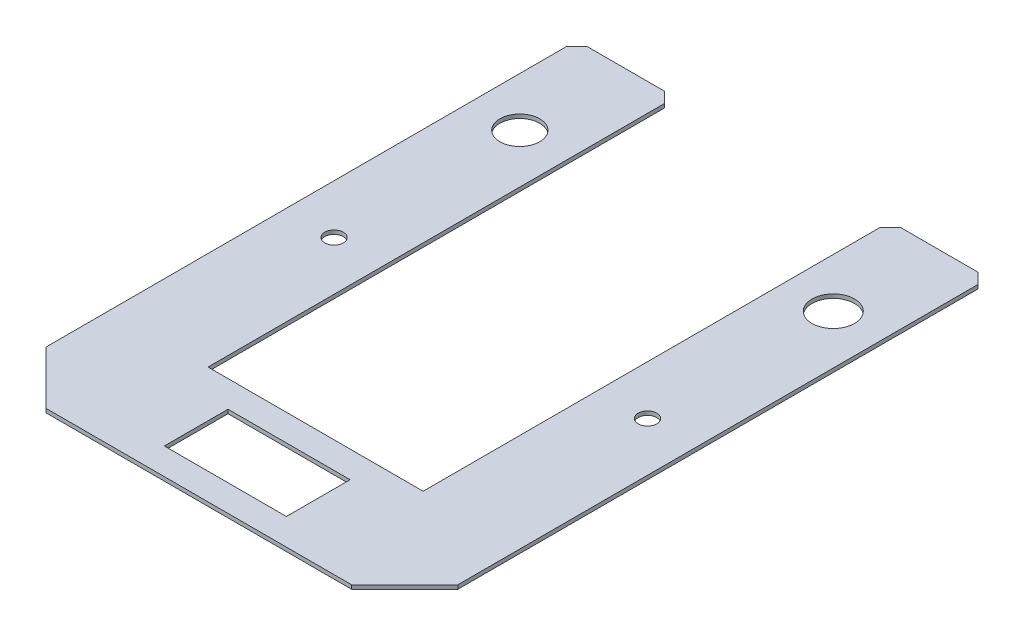
ISO-10303-21;
HEADER;
FILE_DESCRIPTION(('STEP AP214'),'2;1');
FILE_NAME('part.step','',(''),(''),'','','');
FILE_SCHEMA(('AUTOMOTIVE_DESIGN { 1 0 10303 214 1 1 1 1 }'));
ENDSEC;
DATA;
#1=APPLICATION_CONTEXT('core data for automotive mechanical design processes');
#2=APPLICATION_PROTOCOL_DEFINITION('international standard','automotive_design',2000,#1);
#3=PRODUCT_CONTEXT('',#1,'mechanical');
#4=PRODUCT('Part','Part','',(#3));
#5=PRODUCT_RELATED_PRODUCT_CATEGORY('part','',(#4));
#6=PRODUCT_DEFINITION_FORMATION('','',#4);
#7=PRODUCT_DEFINITION_CONTEXT('part definition',#1,'design');
#8=PRODUCT_DEFINITION('design','',#6,#7);
#9=PRODUCT_DEFINITION_SHAPE('','',#8);
#10=(LENGTH_UNIT() NAMED_UNIT(*) SI_UNIT(.MILLI.,.METRE.));
#11=(NAMED_UNIT(*) PLANE_ANGLE_UNIT() SI_UNIT($,.RADIAN.));
#12=(NAMED_UNIT(*) SI_UNIT($,.STERADIAN.) SOLID_ANGLE_UNIT());
#13=UNCERTAINTY_MEASURE_WITH_UNIT(LENGTH_MEASURE(1.E-05),#10,'distance_accuracy_value','');
#14=(GEOMETRIC_REPRESENTATION_CONTEXT(3) GLOBAL_UNCERTAINTY_ASSIGNED_CONTEXT((#13)) GLOBAL_UNIT_ASSIGNED_CONTEXT((#10,
#11,#12)) REPRESENTATION_CONTEXT('',''));
#15=CARTESIAN_POINT('',(0.,0.,0.));
#16=DIRECTION('',(0.,0.,1.));
#17=DIRECTION('',(1.,0.,0.));
#18=AXIS2_PLACEMENT_3D('',#15,#16,#17);
#19=CARTESIAN_POINT('',(-20.,0.7366,-11.));
#20=DIRECTION('',(0.,0.,1.));
#21=DIRECTION('',(1.,0.,0.));
#22=AXIS2_PLACEMENT_3D('',#19,#20,#21);
#23=PLANE('',#22);
#24=DIRECTION('',(-1.,0.,0.));
#25=VECTOR('',#24,1.);
#26=CARTESIAN_POINT('',(-20.,0.,-11.));
#27=LINE('',#26,#25);
#28=CARTESIAN_POINT('',(20.2623728614757,0.,-11.));
#29=VERTEX_POINT('',#28);
#30=CARTESIAN_POINT('',(-20.2623728614757,0.,-11.));
#31=VERTEX_POINT('',#30);
#32=EDGE_CURVE('E233',#29,#31,#27,.T.);
#33=ORIENTED_EDGE('',*,*,#32,.T.);
#34=DIRECTION('',(0.,1.,0.));
#35=VECTOR('',#34,1.);
#36=CARTESIAN_POINT('',(-20.2623728614757,0.,-11.));
#37=LINE('',#36,#35);
#38=CARTESIAN_POINT('',(-20.2623728614757,0.736600000000005,-11.));
#39=VERTEX_POINT('',#38);
#40=EDGE_CURVE('E345',#31,#39,#37,.T.);
#41=ORIENTED_EDGE('',*,*,#40,.T.);
#42=DIRECTION('',(-1.,0.,0.));
#43=VECTOR('',#42,1.);
#44=CARTESIAN_POINT('',(-20.,0.7366,-11.));
#45=LINE('',#44,#43);
#46=CARTESIAN_POINT('',(20.2623728614757,0.736599999999997,-11.));
#47=VERTEX_POINT('',#46);
#48=EDGE_CURVE('E364',#47,#39,#45,.T.);
#49=ORIENTED_EDGE('',*,*,#48,.F.);
#50=DIRECTION('',(0.,1.,0.));
#51=VECTOR('',#50,1.);
#52=CARTESIAN_POINT('',(20.2623728614757,0.,-11.));
#53=LINE('',#52,#51);
#54=EDGE_CURVE('E234',#29,#47,#53,.T.);
#55=ORIENTED_EDGE('',*,*,#54,.F.);
#56=EDGE_LOOP('',(#33,#41,#49,#55));
#57=FACE_BOUND('',#56,.T.);
#58=ADVANCED_FACE('F89',(#57),#23,.F.);
#59=CARTESIAN_POINT('',(-20.,0.7366,11.));
#60=DIRECTION('',(0.,0.,-1.));
#61=DIRECTION('',(-1.,0.,0.));
#62=AXIS2_PLACEMENT_3D('',#59,#60,#61);
#63=PLANE('',#62);
#64=DIRECTION('',(1.,0.,0.));
#65=VECTOR('',#64,1.);
#66=CARTESIAN_POINT('',(-20.,0.7366,11.));
#67=LINE('',#66,#65);
#68=CARTESIAN_POINT('',(-28.7891728614757,0.736600000000056,11.));
#69=VERTEX_POINT('',#68);
#70=CARTESIAN_POINT('',(28.7891728614757,0.736600000000053,11.));
#71=VERTEX_POINT('',#70);
#72=EDGE_CURVE('E366',#69,#71,#67,.T.);
#73=ORIENTED_EDGE('',*,*,#72,.F.);
#74=DIRECTION('',(0.,-1.,0.));
#75=VECTOR('',#74,1.);
#76=CARTESIAN_POINT('',(-28.7891728614757,0.736600000000056,11.));
#77=LINE('',#76,#75);
#78=CARTESIAN_POINT('',(-28.7891728614757,0.,11.));
#79=VERTEX_POINT('',#78);
#80=EDGE_CURVE('E288',#69,#79,#77,.T.);
#81=ORIENTED_EDGE('',*,*,#80,.T.);
#82=DIRECTION('',(1.,0.,0.));
#83=VECTOR('',#82,1.);
#84=CARTESIAN_POINT('',(-20.,0.,11.));
#85=LINE('',#84,#83);
#86=CARTESIAN_POINT('',(28.7891728614757,0.,11.));
#87=VERTEX_POINT('',#86);
#88=EDGE_CURVE('E367',#79,#87,#85,.T.);
#89=ORIENTED_EDGE('',*,*,#88,.T.);
#90=DIRECTION('',(0.,1.,0.));
#91=VECTOR('',#90,1.);
#92=CARTESIAN_POINT('',(28.7891728614757,0.736600000000053,11.));
#93=LINE('',#92,#91);
#94=EDGE_CURVE('E257',#87,#71,#93,.T.);
#95=ORIENTED_EDGE('',*,*,#94,.T.);
#96=EDGE_LOOP('',(#73,#81,#89,#95));
#97=FACE_BOUND('',#96,.T.);
#98=ADVANCED_FACE('F394',(#97),#63,.F.);
#99=CARTESIAN_POINT('',(0.,0.7366,0.));
#100=DIRECTION('',(0.,-1.,0.));
#101=DIRECTION('',(0.,0.,-1.));
#102=AXIS2_PLACEMENT_3D('',#99,#100,#101);
#103=PLANE('',#102);
#104=DIRECTION('',(-1.,0.,0.));
#105=VECTOR('',#104,1.);
#106=CARTESIAN_POINT('',(-11.5,0.7366,-6.));
#107=LINE('',#106,#105);
#108=CARTESIAN_POINT('',(11.5,0.7366,-6.));
#109=VERTEX_POINT('',#108);
#110=CARTESIAN_POINT('',(-11.5,0.7366,-6.));
#111=VERTEX_POINT('',#110);
#112=EDGE_CURVE('E349',#109,#111,#107,.T.);
#113=ORIENTED_EDGE('',*,*,#112,.F.);
#114=DIRECTION('',(0.,0.,-1.));
#115=VECTOR('',#114,1.);
#116=CARTESIAN_POINT('',(11.5,0.7366,6.));
#117=LINE('',#116,#115);
#118=CARTESIAN_POINT('',(11.5,0.7366,6.));
#119=VERTEX_POINT('',#118);
#120=EDGE_CURVE('E104',#119,#109,#117,.T.);
#121=ORIENTED_EDGE('',*,*,#120,.F.);
#122=DIRECTION('',(1.,0.,0.));
#123=VECTOR('',#122,1.);
#124=CARTESIAN_POINT('',(-11.5,0.7366,6.));
#125=LINE('',#124,#123);
#126=CARTESIAN_POINT('',(-11.5,0.7366,6.));
#127=VERTEX_POINT('',#126);
#128=EDGE_CURVE('E354',#127,#119,#125,.T.);
#129=ORIENTED_EDGE('',*,*,#128,.F.);
#130=DIRECTION('',(0.,0.,1.));
#131=VECTOR('',#130,1.);
#132=CARTESIAN_POINT('',(-11.5,0.7366,6.));
#133=LINE('',#132,#131);
#134=EDGE_CURVE('E351',#111,#127,#133,.T.);
#135=ORIENTED_EDGE('',*,*,#134,.F.);
#136=EDGE_LOOP('',(#113,#121,#129,#135));
#137=FACE_BOUND('',#136,.T.);
#138=ORIENTED_EDGE('',*,*,#48,.T.);
#139=DIRECTION('',(0.,0.,-1.));
#140=VECTOR('',#139,1.);
#141=CARTESIAN_POINT('',(-20.2623728614757,0.7366,11.));
#142=LINE('',#141,#140);
#143=CARTESIAN_POINT('',(-20.2623728614757,0.736600000000025,-97.));
#144=VERTEX_POINT('',#143);
#145=EDGE_CURVE('E302',#144,#39,#142,.F.);
#146=ORIENTED_EDGE('',*,*,#145,.F.);
#147=DIRECTION('',(0.70710678118655,0.,0.707106781186545));
#148=VECTOR('',#147,1.);
#149=CARTESIAN_POINT('',(-20.2623728614757,0.736600000000025,-97.));
#150=LINE('',#149,#148);
#151=CARTESIAN_POINT('',(-22.2623728614757,0.736600000000039,-99.));
#152=VERTEX_POINT('',#151);
#153=EDGE_CURVE('E314',#144,#152,#150,.F.);
#154=ORIENTED_EDGE('',*,*,#153,.T.);
#155=DIRECTION('',(-1.,0.,0.));
#156=VECTOR('',#155,1.);
#157=CARTESIAN_POINT('',(-38.7891728614757,0.73660000000015,-99.));
#158=LINE('',#157,#156);
#159=CARTESIAN_POINT('',(-36.7891728614757,0.736600000000136,-99.));
#160=VERTEX_POINT('',#159);
#161=EDGE_CURVE('E340',#160,#152,#158,.F.);
#162=ORIENTED_EDGE('',*,*,#161,.F.);
#163=DIRECTION('',(0.70710678118655,0.,-0.707106781186545));
#164=VECTOR('',#163,1.);
#165=CARTESIAN_POINT('',(-38.7891728614757,0.73660000000015,-97.));
#166=LINE('',#165,#164);
#167=CARTESIAN_POINT('',(-38.7891728614757,0.73660000000015,-97.));
#168=VERTEX_POINT('',#167);
#169=EDGE_CURVE('E311',#160,#168,#166,.F.);
#170=ORIENTED_EDGE('',*,*,#169,.T.);
#171=DIRECTION('',(0.,0.,1.));
#172=VECTOR('',#171,1.);
#173=CARTESIAN_POINT('',(-38.7891728614757,0.736600000000125,11.));
#174=LINE('',#173,#172);
#175=CARTESIAN_POINT('',(-38.7891728614757,0.736600000000129,0.99999999999998));
#176=VERTEX_POINT('',#175);
#177=EDGE_CURVE('E334',#176,#168,#174,.F.);
#178=ORIENTED_EDGE('',*,*,#177,.F.);
#179=DIRECTION('',(-0.707106781186546,0.,-0.707106781186549));
#180=VECTOR('',#179,1.);
#181=CARTESIAN_POINT('',(-28.7891728614757,0.736600000000056,11.));
#182=LINE('',#181,#180);
#183=EDGE_CURVE('E316',#176,#69,#182,.F.);
#184=ORIENTED_EDGE('',*,*,#183,.T.);
#185=ORIENTED_EDGE('',*,*,#72,.T.);
#186=DIRECTION('',(-0.707106781186549,0.,0.707106781186546));
#187=VECTOR('',#186,1.);
#188=CARTESIAN_POINT('',(29.6574728614756,0.736600000000059,10.1317));
#189=LINE('',#188,#187);
#190=CARTESIAN_POINT('',(38.7891728614757,0.736600000000122,1.00000000000002));
#191=VERTEX_POINT('',#190);
#192=EDGE_CURVE('E265',#71,#191,#189,.F.);
#193=ORIENTED_EDGE('',*,*,#192,.T.);
#194=DIRECTION('',(0.,0.,1.));
#195=VECTOR('',#194,1.);
#196=CARTESIAN_POINT('',(38.7891728614757,0.736600000000122,11.));
#197=LINE('',#196,#195);
#198=CARTESIAN_POINT('',(38.7891728614757,0.736600000000108,-97.));
#199=VERTEX_POINT('',#198);
#200=EDGE_CURVE('E278',#199,#191,#197,.T.);
#201=ORIENTED_EDGE('',*,*,#200,.F.);
#202=DIRECTION('',(0.707106781186545,0.,0.70710678118655));
#203=VECTOR('',#202,1.);
#204=CARTESIAN_POINT('',(77.6574728614757,0.736600000000386,-58.1316999999997));
#205=LINE('',#204,#203);
#206=CARTESIAN_POINT('',(36.7891728614757,0.736600000000094,-99.));
#207=VERTEX_POINT('',#206);
#208=EDGE_CURVE('E263',#199,#207,#205,.F.);
#209=ORIENTED_EDGE('',*,*,#208,.T.);
#210=DIRECTION('',(1.,0.,0.));
#211=VECTOR('',#210,1.);
#212=CARTESIAN_POINT('',(38.7891728614757,0.736600000000108,-99.));
#213=LINE('',#212,#211);
#214=CARTESIAN_POINT('',(22.2623728614757,0.736599999999997,-99.));
#215=VERTEX_POINT('',#214);
#216=EDGE_CURVE('E285',#215,#207,#213,.T.);
#217=ORIENTED_EDGE('',*,*,#216,.F.);
#218=DIRECTION('',(0.707106781186545,0.,-0.70710678118655));
#219=VECTOR('',#218,1.);
#220=CARTESIAN_POINT('',(-28.6059271385243,0.736599999999654,-48.1316999999996));
#221=LINE('',#220,#219);
#222=CARTESIAN_POINT('',(20.2623728614757,0.736599999999983,-97.));
#223=VERTEX_POINT('',#222);
#224=EDGE_CURVE('E261',#215,#223,#221,.F.);
#225=ORIENTED_EDGE('',*,*,#224,.T.);
#226=DIRECTION('',(0.,0.,1.));
#227=VECTOR('',#226,1.);
#228=CARTESIAN_POINT('',(20.2623728614757,0.736599999999997,0.));
#229=LINE('',#228,#227);
#230=EDGE_CURVE('E222',#223,#47,#229,.T.);
#231=ORIENTED_EDGE('',*,*,#230,.T.);
#232=EDGE_LOOP('',(#138,#146,#154,#162,#170,#178,#184,#185,#193,#201,#209,#217,#225,#231));
#233=FACE_BOUND('',#232,.T.);
#234=CARTESIAN_POINT('',(-29.5257728614757,0.736600000000084,-79.));
#235=DIRECTION('',(0.,1.,0.));
#236=DIRECTION('',(-1.,0.,0.));
#237=AXIS2_PLACEMENT_3D('',#234,#235,#236);
#238=CIRCLE('',#237,3.75000000000001);
#239=CARTESIAN_POINT('',(-33.2757728614757,0.73660000000011,-79.));
#240=VERTEX_POINT('',#239);
#241=EDGE_CURVE('E319',#240,#240,#238,.T.);
#242=ORIENTED_EDGE('',*,*,#241,.F.);
#243=EDGE_LOOP('',(#242));
#244=FACE_BOUND('',#243,.T.);
#245=CARTESIAN_POINT('',(-29.5257728614757,0.736600000000077,-44.));
#246=DIRECTION('',(0.,1.,0.));
#247=DIRECTION('',(-1.,0.,0.));
#248=AXIS2_PLACEMENT_3D('',#245,#246,#247);
#249=CIRCLE('',#248,1.75);
#250=CARTESIAN_POINT('',(-31.2757728614757,0.736600000000089,-44.));
#251=VERTEX_POINT('',#250);
#252=EDGE_CURVE('E325',#251,#251,#249,.T.);
#253=ORIENTED_EDGE('',*,*,#252,.F.);
#254=EDGE_LOOP('',(#253));
#255=FACE_BOUND('',#254,.T.);
#256=CARTESIAN_POINT('',(29.5257728614757,0.736600000000053,-44.));
#257=DIRECTION('',(0.,1.,0.));
#258=DIRECTION('',(-1.,0.,0.));
#259=AXIS2_PLACEMENT_3D('',#256,#257,#258);
#260=CIRCLE('',#259,1.75);
#261=CARTESIAN_POINT('',(27.7757728614757,0.73660000000004,-44.));
#262=VERTEX_POINT('',#261);
#263=EDGE_CURVE('E267',#262,#262,#260,.T.);
#264=ORIENTED_EDGE('',*,*,#263,.F.);
#265=EDGE_LOOP('',(#264));
#266=FACE_BOUND('',#265,.T.);
#267=CARTESIAN_POINT('',(29.5257728614757,0.736600000000049,-79.));
#268=DIRECTION('',(0.,1.,0.));
#269=DIRECTION('',(-1.,0.,0.));
#270=AXIS2_PLACEMENT_3D('',#267,#268,#269);
#271=CIRCLE('',#270,4.00000000000001);
#272=CARTESIAN_POINT('',(25.5257728614757,0.736600000000021,-79.));
#273=VERTEX_POINT('',#272);
#274=EDGE_CURVE('E270',#273,#273,#271,.T.);
#275=ORIENTED_EDGE('',*,*,#274,.F.);
#276=EDGE_LOOP('',(#275));
#277=FACE_BOUND('',#276,.T.);
#278=ADVANCED_FACE('F391',(#137,#233,#244,#255,#266,#277),#103,.F.);
#279=CARTESIAN_POINT('',(0.,0.,0.));
#280=DIRECTION('',(0.,-1.,0.));
#281=DIRECTION('',(0.,0.,-1.));
#282=AXIS2_PLACEMENT_3D('',#279,#280,#281);
#283=PLANE('',#282);
#284=DIRECTION('',(0.,0.,1.));
#285=VECTOR('',#284,1.);
#286=CARTESIAN_POINT('',(11.5,0.,0.));
#287=LINE('',#286,#285);
#288=CARTESIAN_POINT('',(11.5,0.,-6.));
#289=VERTEX_POINT('',#288);
#290=CARTESIAN_POINT('',(11.5,0.,6.));
#291=VERTEX_POINT('',#290);
#292=EDGE_CURVE('E13',#289,#291,#287,.T.);
#293=ORIENTED_EDGE('',*,*,#292,.F.);
#294=DIRECTION('',(1.,0.,0.));
#295=VECTOR('',#294,1.);
#296=CARTESIAN_POINT('',(0.,0.,-6.));
#297=LINE('',#296,#295);
#298=CARTESIAN_POINT('',(-11.5,0.,-6.));
#299=VERTEX_POINT('',#298);
#300=EDGE_CURVE('E369',#299,#289,#297,.T.);
#301=ORIENTED_EDGE('',*,*,#300,.F.);
#302=DIRECTION('',(0.,0.,-1.));
#303=VECTOR('',#302,1.);
#304=CARTESIAN_POINT('',(-11.5,0.,0.));
#305=LINE('',#304,#303);
#306=CARTESIAN_POINT('',(-11.5,0.,6.));
#307=VERTEX_POINT('',#306);
#308=EDGE_CURVE('E373',#307,#299,#305,.T.);
#309=ORIENTED_EDGE('',*,*,#308,.F.);
#310=DIRECTION('',(-1.,0.,0.));
#311=VECTOR('',#310,1.);
#312=CARTESIAN_POINT('',(0.,0.,6.));
#313=LINE('',#312,#311);
#314=EDGE_CURVE('E97',#291,#307,#313,.T.);
#315=ORIENTED_EDGE('',*,*,#314,.F.);
#316=EDGE_LOOP('',(#293,#301,#309,#315));
#317=FACE_BOUND('',#316,.T.);
#318=ORIENTED_EDGE('',*,*,#88,.F.);
#319=DIRECTION('',(0.707106781186546,0.,0.707106781186549));
#320=VECTOR('',#319,1.);
#321=CARTESIAN_POINT('',(-29.6574728614757,0.,10.1317));
#322=LINE('',#321,#320);
#323=CARTESIAN_POINT('',(-38.7891728614757,1.28369537222284E-13,0.99999999999998));
#324=VERTEX_POINT('',#323);
#325=EDGE_CURVE('E300',#79,#324,#322,.F.);
#326=ORIENTED_EDGE('',*,*,#325,.T.);
#327=DIRECTION('',(0.,0.,-1.));
#328=VECTOR('',#327,1.);
#329=CARTESIAN_POINT('',(-38.7891728614757,1.28369537222284E-13,0.));
#330=LINE('',#329,#328);
#331=CARTESIAN_POINT('',(-38.7891728614757,1.49186218934005E-13,-97.));
#332=VERTEX_POINT('',#331);
#333=EDGE_CURVE('E298',#324,#332,#330,.T.);
#334=ORIENTED_EDGE('',*,*,#333,.T.);
#335=DIRECTION('',(-0.70710678118655,0.,0.707106781186545));
#336=VECTOR('',#335,1.);
#337=CARTESIAN_POINT('',(-77.6574728614756,4.1286418728248E-13,-58.1317000000004));
#338=LINE('',#337,#336);
#339=CARTESIAN_POINT('',(-36.7891728614757,1.35308431126191E-13,-99.));
#340=VERTEX_POINT('',#339);
#341=EDGE_CURVE('E296',#332,#340,#338,.F.);
#342=ORIENTED_EDGE('',*,*,#341,.T.);
#343=DIRECTION('',(1.,0.,0.));
#344=VECTOR('',#343,1.);
#345=CARTESIAN_POINT('',(-19.5257728614757,0.,-99.));
#346=LINE('',#345,#344);
#347=CARTESIAN_POINT('',(-22.2623728614757,0.,-99.));
#348=VERTEX_POINT('',#347);
#349=EDGE_CURVE('E293',#340,#348,#346,.T.);
#350=ORIENTED_EDGE('',*,*,#349,.T.);
#351=DIRECTION('',(-0.70710678118655,0.,-0.707106781186545));
#352=VECTOR('',#351,1.);
#353=CARTESIAN_POINT('',(28.6059271385243,-3.22658566531686E-13,-48.1317000000003));
#354=LINE('',#353,#352);
#355=CARTESIAN_POINT('',(-20.2623728614757,0.,-97.));
#356=VERTEX_POINT('',#355);
#357=EDGE_CURVE('E291',#348,#356,#354,.F.);
#358=ORIENTED_EDGE('',*,*,#357,.T.);
#359=DIRECTION('',(0.,0.,-1.));
#360=VECTOR('',#359,1.);
#361=CARTESIAN_POINT('',(-20.2623728614757,0.,11.));
#362=LINE('',#361,#360);
#363=EDGE_CURVE('E308',#31,#356,#362,.T.);
#364=ORIENTED_EDGE('',*,*,#363,.F.);
#365=ORIENTED_EDGE('',*,*,#32,.F.);
#366=DIRECTION('',(0.,0.,-1.));
#367=VECTOR('',#366,1.);
#368=CARTESIAN_POINT('',(20.2623728614757,0.,-99.));
#369=LINE('',#368,#367);
#370=CARTESIAN_POINT('',(20.2623728614757,0.,-97.));
#371=VERTEX_POINT('',#370);
#372=EDGE_CURVE('E219',#371,#29,#369,.F.);
#373=ORIENTED_EDGE('',*,*,#372,.F.);
#374=DIRECTION('',(-0.707106781186545,0.,0.70710678118655));
#375=VECTOR('',#374,1.);
#376=CARTESIAN_POINT('',(22.2623728614757,0.,-99.));
#377=LINE('',#376,#375);
#378=CARTESIAN_POINT('',(22.2623728614757,0.,-99.));
#379=VERTEX_POINT('',#378);
#380=EDGE_CURVE('E230',#371,#379,#377,.F.);
#381=ORIENTED_EDGE('',*,*,#380,.T.);
#382=DIRECTION('',(-1.,0.,0.));
#383=VECTOR('',#382,1.);
#384=CARTESIAN_POINT('',(19.5257728614756,0.,-99.));
#385=LINE('',#384,#383);
#386=CARTESIAN_POINT('',(36.7891728614757,0.,-99.));
#387=VERTEX_POINT('',#386);
#388=EDGE_CURVE('E240',#379,#387,#385,.F.);
#389=ORIENTED_EDGE('',*,*,#388,.T.);
#390=DIRECTION('',(-0.707106781186545,0.,-0.70710678118655));
#391=VECTOR('',#390,1.);
#392=CARTESIAN_POINT('',(36.7891728614757,0.,-99.));
#393=LINE('',#392,#391);
#394=CARTESIAN_POINT('',(38.7891728614757,1.07552855510562E-13,-97.));
#395=VERTEX_POINT('',#394);
#396=EDGE_CURVE('E225',#387,#395,#393,.F.);
#397=ORIENTED_EDGE('',*,*,#396,.T.);
#398=DIRECTION('',(0.,0.,-1.));
#399=VECTOR('',#398,1.);
#400=CARTESIAN_POINT('',(38.7891728614757,1.21430643318376E-13,0.));
#401=LINE('',#400,#399);
#402=CARTESIAN_POINT('',(38.7891728614757,1.21430643318376E-13,1.00000000000002));
#403=VERTEX_POINT('',#402);
#404=EDGE_CURVE('E245',#395,#403,#401,.F.);
#405=ORIENTED_EDGE('',*,*,#404,.T.);
#406=DIRECTION('',(0.707106781186549,0.,-0.707106781186546));
#407=VECTOR('',#406,1.);
#408=CARTESIAN_POINT('',(38.7891728614757,1.21430643318376E-13,1.00000000000002));
#409=LINE('',#408,#407);
#410=EDGE_CURVE('E241',#403,#87,#409,.F.);
#411=ORIENTED_EDGE('',*,*,#410,.T.);
#412=EDGE_LOOP('',(#318,#326,#334,#342,#350,#358,#364,#365,#373,#381,#389,#397,#405,#411));
#413=FACE_BOUND('',#412,.T.);
#414=CARTESIAN_POINT('',(-29.5257728614757,0.,-79.));
#415=DIRECTION('',(0.,-1.,0.));
#416=DIRECTION('',(1.,0.,0.));
#417=AXIS2_PLACEMENT_3D('',#414,#415,#416);
#418=CIRCLE('',#417,3.75000000000001);
#419=CARTESIAN_POINT('',(-25.7757728614757,0.,-79.));
#420=VERTEX_POINT('',#419);
#421=EDGE_CURVE('E322',#420,#420,#418,.T.);
#422=ORIENTED_EDGE('',*,*,#421,.F.);
#423=EDGE_LOOP('',(#422));
#424=FACE_BOUND('',#423,.T.);
#425=CARTESIAN_POINT('',(-29.5257728614757,0.,-44.));
#426=DIRECTION('',(0.,-1.,0.));
#427=DIRECTION('',(1.,0.,0.));
#428=AXIS2_PLACEMENT_3D('',#425,#426,#427);
#429=CIRCLE('',#428,1.75);
#430=CARTESIAN_POINT('',(-27.7757728614757,0.,-44.));
#431=VERTEX_POINT('',#430);
#432=EDGE_CURVE('E328',#431,#431,#429,.T.);
#433=ORIENTED_EDGE('',*,*,#432,.F.);
#434=EDGE_LOOP('',(#433));
#435=FACE_BOUND('',#434,.T.);
#436=CARTESIAN_POINT('',(29.5257728614757,0.,-44.));
#437=DIRECTION('',(0.,1.,0.));
#438=DIRECTION('',(-1.,0.,0.));
#439=AXIS2_PLACEMENT_3D('',#436,#437,#438);
#440=CIRCLE('',#439,1.75);
#441=CARTESIAN_POINT('',(27.7757728614757,0.,-44.));
#442=VERTEX_POINT('',#441);
#443=EDGE_CURVE('E254',#442,#442,#440,.T.);
#444=ORIENTED_EDGE('',*,*,#443,.T.);
#445=EDGE_LOOP('',(#444));
#446=FACE_BOUND('',#445,.T.);
#447=CARTESIAN_POINT('',(29.5257728614757,0.,-79.));
#448=DIRECTION('',(0.,1.,0.));
#449=DIRECTION('',(-1.,0.,0.));
#450=AXIS2_PLACEMENT_3D('',#447,#448,#449);
#451=CIRCLE('',#450,4.00000000000001);
#452=CARTESIAN_POINT('',(25.5257728614757,0.,-79.));
#453=VERTEX_POINT('',#452);
#454=EDGE_CURVE('E251',#453,#453,#451,.T.);
#455=ORIENTED_EDGE('',*,*,#454,.T.);
#456=EDGE_LOOP('',(#455));
#457=FACE_BOUND('',#456,.T.);
#458=ADVANCED_FACE('F91',(#317,#413,#424,#435,#446,#457),#283,.T.);
#459=CARTESIAN_POINT('',(11.5,-1.2634,6.));
#460=DIRECTION('',(1.,0.,0.));
#461=DIRECTION('',(0.,0.,-1.));
#462=AXIS2_PLACEMENT_3D('',#459,#460,#461);
#463=PLANE('',#462);
#464=ORIENTED_EDGE('',*,*,#292,.T.);
#465=DIRECTION('',(0.,1.,0.));
#466=VECTOR('',#465,1.);
#467=CARTESIAN_POINT('',(11.5,-1.2634,6.));
#468=LINE('',#467,#466);
#469=EDGE_CURVE('E358',#291,#119,#468,.T.);
#470=ORIENTED_EDGE('',*,*,#469,.T.);
#471=ORIENTED_EDGE('',*,*,#120,.T.);
#472=DIRECTION('',(0.,1.,0.));
#473=VECTOR('',#472,1.);
#474=CARTESIAN_POINT('',(11.5,-1.2634,-6.));
#475=LINE('',#474,#473);
#476=EDGE_CURVE('E357',#289,#109,#475,.T.);
#477=ORIENTED_EDGE('',*,*,#476,.F.);
#478=EDGE_LOOP('',(#464,#470,#471,#477));
#479=FACE_BOUND('',#478,.T.);
#480=ADVANCED_FACE('F389',(#479),#463,.F.);
#481=CARTESIAN_POINT('',(-11.5,-1.2634,6.));
#482=DIRECTION('',(0.,0.,1.));
#483=DIRECTION('',(1.,0.,0.));
#484=AXIS2_PLACEMENT_3D('',#481,#482,#483);
#485=PLANE('',#484);
#486=ORIENTED_EDGE('',*,*,#314,.T.);
#487=DIRECTION('',(0.,1.,0.));
#488=VECTOR('',#487,1.);
#489=CARTESIAN_POINT('',(-11.5,-1.2634,6.));
#490=LINE('',#489,#488);
#491=EDGE_CURVE('E360',#307,#127,#490,.T.);
#492=ORIENTED_EDGE('',*,*,#491,.T.);
#493=ORIENTED_EDGE('',*,*,#128,.T.);
#494=ORIENTED_EDGE('',*,*,#469,.F.);
#495=EDGE_LOOP('',(#486,#492,#493,#494));
#496=FACE_BOUND('',#495,.T.);
#497=ADVANCED_FACE('F378',(#496),#485,.F.);
#498=CARTESIAN_POINT('',(-11.5,-1.2634,6.));
#499=DIRECTION('',(-1.,0.,0.));
#500=DIRECTION('',(0.,0.,1.));
#501=AXIS2_PLACEMENT_3D('',#498,#499,#500);
#502=PLANE('',#501);
#503=ORIENTED_EDGE('',*,*,#308,.T.);
#504=DIRECTION('',(0.,1.,0.));
#505=VECTOR('',#504,1.);
#506=CARTESIAN_POINT('',(-11.5,-1.2634,-6.));
#507=LINE('',#506,#505);
#508=EDGE_CURVE('E112',#299,#111,#507,.T.);
#509=ORIENTED_EDGE('',*,*,#508,.T.);
#510=ORIENTED_EDGE('',*,*,#134,.T.);
#511=ORIENTED_EDGE('',*,*,#491,.F.);
#512=EDGE_LOOP('',(#503,#509,#510,#511));
#513=FACE_BOUND('',#512,.T.);
#514=ADVANCED_FACE('F383',(#513),#502,.F.);
#515=CARTESIAN_POINT('',(-11.5,-1.2634,-6.));
#516=DIRECTION('',(0.,0.,-1.));
#517=DIRECTION('',(-1.,0.,0.));
#518=AXIS2_PLACEMENT_3D('',#515,#516,#517);
#519=PLANE('',#518);
#520=ORIENTED_EDGE('',*,*,#300,.T.);
#521=ORIENTED_EDGE('',*,*,#476,.T.);
#522=ORIENTED_EDGE('',*,*,#112,.T.);
#523=ORIENTED_EDGE('',*,*,#508,.F.);
#524=EDGE_LOOP('',(#520,#521,#522,#523));
#525=FACE_BOUND('',#524,.T.);
#526=ADVANCED_FACE('F387',(#525),#519,.F.);
#527=CARTESIAN_POINT('',(-38.7891728614757,0.73660000000015,-97.));
#528=DIRECTION('',(0.707106781186545,0.,0.70710678118655));
#529=DIRECTION('',(0.,-1.,0.));
#530=AXIS2_PLACEMENT_3D('',#527,#528,#529);
#531=PLANE('',#530);
#532=ORIENTED_EDGE('',*,*,#169,.F.);
#533=DIRECTION('',(0.,1.,0.));
#534=VECTOR('',#533,1.);
#535=CARTESIAN_POINT('',(-36.7891728614757,0.736600000000136,-99.));
#536=LINE('',#535,#534);
#537=EDGE_CURVE('E343',#340,#160,#536,.T.);
#538=ORIENTED_EDGE('',*,*,#537,.F.);
#539=ORIENTED_EDGE('',*,*,#341,.F.);
#540=DIRECTION('',(0.,-1.,0.));
#541=VECTOR('',#540,1.);
#542=CARTESIAN_POINT('',(-38.7891728614757,0.73660000000015,-97.));
#543=LINE('',#542,#541);
#544=EDGE_CURVE('E331',#168,#332,#543,.T.);
#545=ORIENTED_EDGE('',*,*,#544,.F.);
#546=EDGE_LOOP('',(#532,#538,#539,#545));
#547=FACE_BOUND('',#546,.T.);
#548=ADVANCED_FACE('F429',(#547),#531,.F.);
#549=CARTESIAN_POINT('',(-38.7891728614757,0.73660000000015,-99.));
#550=DIRECTION('',(0.,0.,-1.));
#551=DIRECTION('',(0.,1.,0.));
#552=AXIS2_PLACEMENT_3D('',#549,#550,#551);
#553=PLANE('',#552);
#554=ORIENTED_EDGE('',*,*,#349,.F.);
#555=ORIENTED_EDGE('',*,*,#537,.T.);
#556=ORIENTED_EDGE('',*,*,#161,.T.);
#557=DIRECTION('',(0.,-1.,0.));
#558=VECTOR('',#557,1.);
#559=CARTESIAN_POINT('',(-22.2623728614757,0.736600000000039,-99.));
#560=LINE('',#559,#558);
#561=EDGE_CURVE('E338',#152,#348,#560,.T.);
#562=ORIENTED_EDGE('',*,*,#561,.T.);
#563=EDGE_LOOP('',(#554,#555,#556,#562));
#564=FACE_BOUND('',#563,.T.);
#565=ADVANCED_FACE('F464',(#564),#553,.T.);
#566=CARTESIAN_POINT('',(-20.2623728614757,0.,-97.));
#567=DIRECTION('',(-0.707106781186545,0.,0.70710678118655));
#568=DIRECTION('',(0.,1.,0.));
#569=AXIS2_PLACEMENT_3D('',#566,#567,#568);
#570=PLANE('',#569);
#571=ORIENTED_EDGE('',*,*,#357,.F.);
#572=ORIENTED_EDGE('',*,*,#561,.F.);
#573=ORIENTED_EDGE('',*,*,#153,.F.);
#574=DIRECTION('',(0.,1.,0.));
#575=VECTOR('',#574,1.);
#576=CARTESIAN_POINT('',(-20.2623728614757,0.,-97.));
#577=LINE('',#576,#575);
#578=EDGE_CURVE('E305',#356,#144,#577,.T.);
#579=ORIENTED_EDGE('',*,*,#578,.F.);
#580=EDGE_LOOP('',(#571,#572,#573,#579));
#581=FACE_BOUND('',#580,.T.);
#582=ADVANCED_FACE('F457',(#581),#570,.F.);
#583=CARTESIAN_POINT('',(-28.7891728614757,0.736600000000056,11.));
#584=DIRECTION('',(0.707106781186549,0.,-0.707106781186546));
#585=DIRECTION('',(0.,-1.,0.));
#586=AXIS2_PLACEMENT_3D('',#583,#584,#585);
#587=PLANE('',#586);
#588=ORIENTED_EDGE('',*,*,#183,.F.);
#589=DIRECTION('',(0.,1.,0.));
#590=VECTOR('',#589,1.);
#591=CARTESIAN_POINT('',(-38.7891728614757,0.736600000000129,0.99999999999998));
#592=LINE('',#591,#590);
#593=EDGE_CURVE('E336',#324,#176,#592,.T.);
#594=ORIENTED_EDGE('',*,*,#593,.F.);
#595=ORIENTED_EDGE('',*,*,#325,.F.);
#596=ORIENTED_EDGE('',*,*,#80,.F.);
#597=EDGE_LOOP('',(#588,#594,#595,#596));
#598=FACE_BOUND('',#597,.T.);
#599=ADVANCED_FACE('F449',(#598),#587,.F.);
#600=CARTESIAN_POINT('',(-38.7891728614757,0.736600000000125,11.));
#601=DIRECTION('',(-1.,0.,0.));
#602=DIRECTION('',(0.,-1.,0.));
#603=AXIS2_PLACEMENT_3D('',#600,#601,#602);
#604=PLANE('',#603);
#605=ORIENTED_EDGE('',*,*,#333,.F.);
#606=ORIENTED_EDGE('',*,*,#593,.T.);
#607=ORIENTED_EDGE('',*,*,#177,.T.);
#608=ORIENTED_EDGE('',*,*,#544,.T.);
#609=EDGE_LOOP('',(#605,#606,#607,#608));
#610=FACE_BOUND('',#609,.T.);
#611=ADVANCED_FACE('F445',(#610),#604,.T.);
#612=CARTESIAN_POINT('',(-29.5257728614757,-1.26339999999993,-44.));
#613=DIRECTION('',(0.,1.,0.));
#614=DIRECTION('',(-1.,0.,0.));
#615=AXIS2_PLACEMENT_3D('',#612,#613,#614);
#616=CYLINDRICAL_SURFACE('',#615,1.75);
#617=ORIENTED_EDGE('',*,*,#432,.T.);
#618=EDGE_LOOP('',(#617));
#619=FACE_BOUND('',#618,.T.);
#620=ORIENTED_EDGE('',*,*,#252,.T.);
#621=EDGE_LOOP('',(#620));
#622=FACE_BOUND('',#621,.T.);
#623=ADVANCED_FACE('F441',(#619,#622),#616,.F.);
#624=CARTESIAN_POINT('',(-29.5257728614757,-1.26339999999992,-79.));
#625=DIRECTION('',(0.,1.,0.));
#626=DIRECTION('',(-1.,0.,0.));
#627=AXIS2_PLACEMENT_3D('',#624,#625,#626);
#628=CYLINDRICAL_SURFACE('',#627,3.75000000000001);
#629=ORIENTED_EDGE('',*,*,#421,.T.);
#630=EDGE_LOOP('',(#629));
#631=FACE_BOUND('',#630,.T.);
#632=ORIENTED_EDGE('',*,*,#241,.T.);
#633=EDGE_LOOP('',(#632));
#634=FACE_BOUND('',#633,.T.);
#635=ADVANCED_FACE('F437',(#631,#634),#628,.F.);
#636=CARTESIAN_POINT('',(-20.2623728614757,0.,11.));
#637=DIRECTION('',(1.,0.,0.));
#638=DIRECTION('',(0.,1.,0.));
#639=AXIS2_PLACEMENT_3D('',#636,#637,#638);
#640=PLANE('',#639);
#641=ORIENTED_EDGE('',*,*,#363,.T.);
#642=ORIENTED_EDGE('',*,*,#578,.T.);
#643=ORIENTED_EDGE('',*,*,#145,.T.);
#644=ORIENTED_EDGE('',*,*,#40,.F.);
#645=EDGE_LOOP('',(#641,#642,#643,#644));
#646=FACE_BOUND('',#645,.T.);
#647=ADVANCED_FACE('F434',(#646),#640,.T.);
#648=CARTESIAN_POINT('',(22.2623728614757,0.736599999999997,-99.));
#649=DIRECTION('',(0.70710678118655,0.,0.707106781186545));
#650=DIRECTION('',(0.,1.,0.));
#651=AXIS2_PLACEMENT_3D('',#648,#649,#650);
#652=PLANE('',#651);
#653=ORIENTED_EDGE('',*,*,#380,.F.);
#654=DIRECTION('',(0.,-1.,0.));
#655=VECTOR('',#654,1.);
#656=CARTESIAN_POINT('',(20.2623728614757,0.,-97.));
#657=LINE('',#656,#655);
#658=EDGE_CURVE('E215',#223,#371,#657,.T.);
#659=ORIENTED_EDGE('',*,*,#658,.F.);
#660=ORIENTED_EDGE('',*,*,#224,.F.);
#661=DIRECTION('',(0.,1.,0.));
#662=VECTOR('',#661,1.);
#663=CARTESIAN_POINT('',(22.2623728614757,0.736599999999997,-99.));
#664=LINE('',#663,#662);
#665=EDGE_CURVE('E239',#379,#215,#664,.T.);
#666=ORIENTED_EDGE('',*,*,#665,.F.);
#667=EDGE_LOOP('',(#653,#659,#660,#666));
#668=FACE_BOUND('',#667,.T.);
#669=ADVANCED_FACE('F237',(#668),#652,.F.);
#670=CARTESIAN_POINT('',(38.7891728614757,0.736600000000108,-99.));
#671=DIRECTION('',(0.,0.,-1.));
#672=DIRECTION('',(0.,-1.,0.));
#673=AXIS2_PLACEMENT_3D('',#670,#671,#672);
#674=PLANE('',#673);
#675=ORIENTED_EDGE('',*,*,#216,.T.);
#676=DIRECTION('',(0.,-1.,0.));
#677=VECTOR('',#676,1.);
#678=CARTESIAN_POINT('',(36.7891728614757,0.736600000000094,-99.));
#679=LINE('',#678,#677);
#680=EDGE_CURVE('E282',#207,#387,#679,.T.);
#681=ORIENTED_EDGE('',*,*,#680,.T.);
#682=ORIENTED_EDGE('',*,*,#388,.F.);
#683=ORIENTED_EDGE('',*,*,#665,.T.);
#684=EDGE_LOOP('',(#675,#681,#682,#683));
#685=FACE_BOUND('',#684,.T.);
#686=ADVANCED_FACE('F496',(#685),#674,.T.);
#687=CARTESIAN_POINT('',(36.7891728614757,0.736600000000094,-99.));
#688=DIRECTION('',(-0.70710678118655,0.,0.707106781186545));
#689=DIRECTION('',(0.,-1.,0.));
#690=AXIS2_PLACEMENT_3D('',#687,#688,#689);
#691=PLANE('',#690);
#692=ORIENTED_EDGE('',*,*,#208,.F.);
#693=DIRECTION('',(0.,1.,0.));
#694=VECTOR('',#693,1.);
#695=CARTESIAN_POINT('',(38.7891728614757,0.736600000000108,-97.));
#696=LINE('',#695,#694);
#697=EDGE_CURVE('E273',#395,#199,#696,.T.);
#698=ORIENTED_EDGE('',*,*,#697,.F.);
#699=ORIENTED_EDGE('',*,*,#396,.F.);
#700=ORIENTED_EDGE('',*,*,#680,.F.);
#701=EDGE_LOOP('',(#692,#698,#699,#700));
#702=FACE_BOUND('',#701,.T.);
#703=ADVANCED_FACE('F489',(#702),#691,.F.);
#704=CARTESIAN_POINT('',(38.7891728614757,0.736600000000122,11.));
#705=DIRECTION('',(1.,0.,0.));
#706=DIRECTION('',(0.,1.,0.));
#707=AXIS2_PLACEMENT_3D('',#704,#705,#706);
#708=PLANE('',#707);
#709=ORIENTED_EDGE('',*,*,#200,.T.);
#710=DIRECTION('',(0.,-1.,0.));
#711=VECTOR('',#710,1.);
#712=CARTESIAN_POINT('',(38.7891728614757,0.736600000000122,1.00000000000002));
#713=LINE('',#712,#711);
#714=EDGE_CURVE('E275',#191,#403,#713,.T.);
#715=ORIENTED_EDGE('',*,*,#714,.T.);
#716=ORIENTED_EDGE('',*,*,#404,.F.);
#717=ORIENTED_EDGE('',*,*,#697,.T.);
#718=EDGE_LOOP('',(#709,#715,#716,#717));
#719=FACE_BOUND('',#718,.T.);
#720=ADVANCED_FACE('F485',(#719),#708,.T.);
#721=CARTESIAN_POINT('',(38.7891728614757,0.736600000000122,1.00000000000002));
#722=DIRECTION('',(-0.707106781186546,0.,-0.707106781186549));
#723=DIRECTION('',(0.,-1.,0.));
#724=AXIS2_PLACEMENT_3D('',#721,#722,#723);
#725=PLANE('',#724);
#726=ORIENTED_EDGE('',*,*,#192,.F.);
#727=ORIENTED_EDGE('',*,*,#94,.F.);
#728=ORIENTED_EDGE('',*,*,#410,.F.);
#729=ORIENTED_EDGE('',*,*,#714,.F.);
#730=EDGE_LOOP('',(#726,#727,#728,#729));
#731=FACE_BOUND('',#730,.T.);
#732=ADVANCED_FACE('F410',(#731),#725,.F.);
#733=CARTESIAN_POINT('',(29.5257728614757,-1.26339999999995,-79.));
#734=DIRECTION('',(0.,1.,0.));
#735=DIRECTION('',(-1.,0.,0.));
#736=AXIS2_PLACEMENT_3D('',#733,#734,#735);
#737=CYLINDRICAL_SURFACE('',#736,4.00000000000001);
#738=ORIENTED_EDGE('',*,*,#274,.T.);
#739=EDGE_LOOP('',(#738));
#740=FACE_BOUND('',#739,.T.);
#741=ORIENTED_EDGE('',*,*,#454,.F.);
#742=EDGE_LOOP('',(#741));
#743=FACE_BOUND('',#742,.T.);
#744=ADVANCED_FACE('F406',(#740,#743),#737,.F.);
#745=CARTESIAN_POINT('',(29.5257728614757,-1.26339999999995,-44.));
#746=DIRECTION('',(0.,1.,0.));
#747=DIRECTION('',(-1.,0.,0.));
#748=AXIS2_PLACEMENT_3D('',#745,#746,#747);
#749=CYLINDRICAL_SURFACE('',#748,1.75);
#750=ORIENTED_EDGE('',*,*,#263,.T.);
#751=EDGE_LOOP('',(#750));
#752=FACE_BOUND('',#751,.T.);
#753=ORIENTED_EDGE('',*,*,#443,.F.);
#754=EDGE_LOOP('',(#753));
#755=FACE_BOUND('',#754,.T.);
#756=ADVANCED_FACE('F409',(#752,#755),#749,.F.);
#757=CARTESIAN_POINT('',(20.2623728614757,0.,-99.));
#758=DIRECTION('',(-1.,0.,0.));
#759=DIRECTION('',(0.,-1.,0.));
#760=AXIS2_PLACEMENT_3D('',#757,#758,#759);
#761=PLANE('',#760);
#762=ORIENTED_EDGE('',*,*,#230,.F.);
#763=ORIENTED_EDGE('',*,*,#658,.T.);
#764=ORIENTED_EDGE('',*,*,#372,.T.);
#765=ORIENTED_EDGE('',*,*,#54,.T.);
#766=EDGE_LOOP('',(#762,#763,#764,#765));
#767=FACE_BOUND('',#766,.T.);
#768=ADVANCED_FACE('F217',(#767),#761,.T.);
#769=CLOSED_SHELL('',(#58,#98,#278,#458,#480,#497,#514,#526,#548,#565,#582,#599,#611,#623,#635,
#647,#669,#686,#703,#720,#732,#744,#756,#768));
#770=MANIFOLD_SOLID_BREP('B2',#769);
#771=ADVANCED_BREP_SHAPE_REPRESENTATION('',(#18,#770),#14);
#772=SHAPE_DEFINITION_REPRESENTATION(#9,#771);
ENDSEC;
END-ISO-10303-21;
